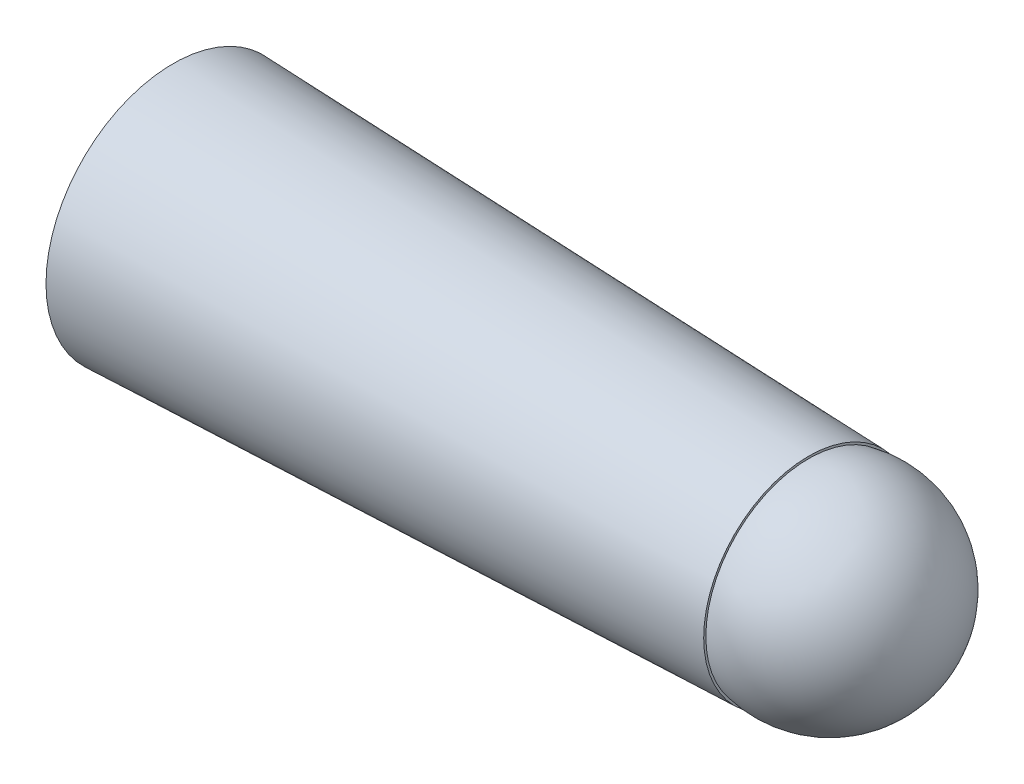
ISO-10303-21;
HEADER;
FILE_DESCRIPTION(('STEP AP214'),'2;1');
FILE_NAME('part.step','',(''),(''),'','','');
FILE_SCHEMA(('AUTOMOTIVE_DESIGN { 1 0 10303 214 1 1 1 1 }'));
ENDSEC;
DATA;
#1=APPLICATION_CONTEXT('core data for automotive mechanical design processes');
#2=APPLICATION_PROTOCOL_DEFINITION('international standard','automotive_design',2000,#1);
#3=PRODUCT_CONTEXT('',#1,'mechanical');
#4=PRODUCT('Part','Part','',(#3));
#5=PRODUCT_RELATED_PRODUCT_CATEGORY('part','',(#4));
#6=PRODUCT_DEFINITION_FORMATION('','',#4);
#7=PRODUCT_DEFINITION_CONTEXT('part definition',#1,'design');
#8=PRODUCT_DEFINITION('design','',#6,#7);
#9=PRODUCT_DEFINITION_SHAPE('','',#8);
#10=(LENGTH_UNIT() NAMED_UNIT(*) SI_UNIT(.MILLI.,.METRE.));
#11=(NAMED_UNIT(*) PLANE_ANGLE_UNIT() SI_UNIT($,.RADIAN.));
#12=(NAMED_UNIT(*) SI_UNIT($,.STERADIAN.) SOLID_ANGLE_UNIT());
#13=UNCERTAINTY_MEASURE_WITH_UNIT(LENGTH_MEASURE(1.E-05),#10,'distance_accuracy_value','');
#14=(GEOMETRIC_REPRESENTATION_CONTEXT(3) GLOBAL_UNCERTAINTY_ASSIGNED_CONTEXT((#13)) GLOBAL_UNIT_ASSIGNED_CONTEXT((#10,
#11,#12)) REPRESENTATION_CONTEXT('',''));
#15=CARTESIAN_POINT('',(0.,0.,0.));
#16=DIRECTION('',(0.,0.,1.));
#17=DIRECTION('',(1.,0.,0.));
#18=AXIS2_PLACEMENT_3D('',#15,#16,#17);
#19=CARTESIAN_POINT('',(15.,0.,0.));
#20=DIRECTION('',(1.,0.,0.));
#21=DIRECTION('',(0.,0.,1.));
#22=AXIS2_PLACEMENT_3D('',#19,#20,#21);
#23=PLANE('',#22);
#24=CARTESIAN_POINT('',(15.,0.,0.));
#25=DIRECTION('',(-1.,0.,0.));
#26=DIRECTION('',(0.,0.,1.));
#27=AXIS2_PLACEMENT_3D('',#24,#25,#26);
#28=CIRCLE('',#27,2.47618845762378);
#29=CARTESIAN_POINT('',(15.,0.,2.47618845762378));
#30=VERTEX_POINT('',#29);
#31=EDGE_CURVE('E10',#30,#30,#28,.T.);
#32=ORIENTED_EDGE('',*,*,#31,.F.);
#33=EDGE_LOOP('',(#32));
#34=FACE_BOUND('',#33,.T.);
#35=CARTESIAN_POINT('',(15.,0.,0.));
#36=DIRECTION('',(-1.,0.,0.));
#37=DIRECTION('',(0.,0.,1.));
#38=AXIS2_PLACEMENT_3D('',#35,#36,#37);
#39=CIRCLE('',#38,2.42518231843902);
#40=CARTESIAN_POINT('',(15.,0.,2.42518231843902));
#41=VERTEX_POINT('',#40);
#42=EDGE_CURVE('E39',#41,#41,#39,.F.);
#43=ORIENTED_EDGE('',*,*,#42,.F.);
#44=EDGE_LOOP('',(#43));
#45=FACE_BOUND('',#44,.T.);
#46=ADVANCED_FACE('F35',(#34,#45),#23,.T.);
#47=CARTESIAN_POINT('',(0.,0.,0.));
#48=DIRECTION('',(-1.,0.,0.));
#49=DIRECTION('',(0.,0.,1.));
#50=AXIS2_PLACEMENT_3D('',#47,#48,#49);
#51=CONICAL_SURFACE('',#50,3.,0.0349065850398866);
#52=ORIENTED_EDGE('',*,*,#31,.T.);
#53=EDGE_LOOP('',(#52));
#54=FACE_BOUND('',#53,.T.);
#55=CARTESIAN_POINT('',(0.,0.,0.));
#56=DIRECTION('',(-1.,0.,0.));
#57=DIRECTION('',(0.,0.,1.));
#58=AXIS2_PLACEMENT_3D('',#55,#56,#57);
#59=CIRCLE('',#58,3.);
#60=CARTESIAN_POINT('',(0.,0.,3.));
#61=VERTEX_POINT('',#60);
#62=EDGE_CURVE('E43',#61,#61,#59,.T.);
#63=ORIENTED_EDGE('',*,*,#62,.F.);
#64=EDGE_LOOP('',(#63));
#65=FACE_BOUND('',#64,.T.);
#66=ADVANCED_FACE('F37',(#54,#65),#51,.T.);
#67=CARTESIAN_POINT('',(0.,0.,0.));
#68=DIRECTION('',(1.,0.,0.));
#69=DIRECTION('',(0.,0.,1.));
#70=AXIS2_PLACEMENT_3D('',#67,#68,#69);
#71=PLANE('',#70);
#72=ORIENTED_EDGE('',*,*,#62,.T.);
#73=EDGE_LOOP('',(#72));
#74=FACE_BOUND('',#73,.T.);
#75=ADVANCED_FACE('F61',(#74),#71,.F.);
#76=CARTESIAN_POINT('',(15.5,0.,0.));
#77=DIRECTION('',(0.,1.,0.));
#78=DIRECTION('',(0.,0.,1.));
#79=AXIS2_PLACEMENT_3D('',#76,#77,#78);
#80=SPHERICAL_SURFACE('',#79,2.47618845762378);
#81=CARTESIAN_POINT('',(15.5,0.,0.));
#82=DIRECTION('',(-1.,0.,0.));
#83=DIRECTION('',(0.,0.,1.));
#84=AXIS2_PLACEMENT_3D('',#81,#82,#83);
#85=SPHERICAL_SURFACE('',#84,2.47618845762378);
#86=ORIENTED_EDGE('',*,*,#42,.T.);
#87=EDGE_LOOP('',(#86));
#88=FACE_BOUND('',#87,.T.);
#89=ADVANCED_FACE('F53',(#88),#85,.T.);
#90=CLOSED_SHELL('',(#46,#66,#75,#89));
#91=MANIFOLD_SOLID_BREP('B2',#90);
#92=ADVANCED_BREP_SHAPE_REPRESENTATION('',(#18,#91),#14);
#93=SHAPE_DEFINITION_REPRESENTATION(#9,#92);
ENDSEC;
END-ISO-10303-21;
